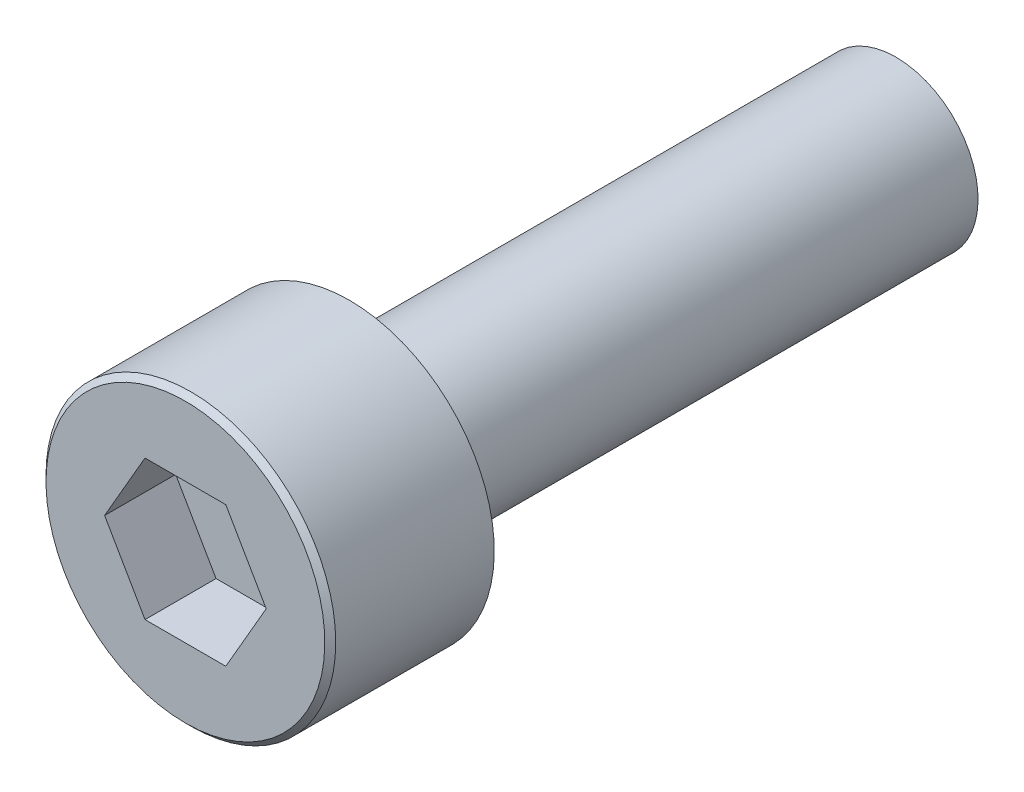
ISO-10303-21;
HEADER;
FILE_DESCRIPTION(('STEP AP214'),'2;1');
FILE_NAME('part.step','',(''),(''),'','','');
FILE_SCHEMA(('AUTOMOTIVE_DESIGN { 1 0 10303 214 1 1 1 1 }'));
ENDSEC;
DATA;
#1=APPLICATION_CONTEXT('core data for automotive mechanical design processes');
#2=APPLICATION_PROTOCOL_DEFINITION('international standard','automotive_design',2000,#1);
#3=PRODUCT_CONTEXT('',#1,'mechanical');
#4=PRODUCT('Part','Part','',(#3));
#5=PRODUCT_RELATED_PRODUCT_CATEGORY('part','',(#4));
#6=PRODUCT_DEFINITION_FORMATION('','',#4);
#7=PRODUCT_DEFINITION_CONTEXT('part definition',#1,'design');
#8=PRODUCT_DEFINITION('design','',#6,#7);
#9=PRODUCT_DEFINITION_SHAPE('','',#8);
#10=(LENGTH_UNIT() NAMED_UNIT(*) SI_UNIT(.MILLI.,.METRE.));
#11=(NAMED_UNIT(*) PLANE_ANGLE_UNIT() SI_UNIT($,.RADIAN.));
#12=(NAMED_UNIT(*) SI_UNIT($,.STERADIAN.) SOLID_ANGLE_UNIT());
#13=UNCERTAINTY_MEASURE_WITH_UNIT(LENGTH_MEASURE(1.E-05),#10,'distance_accuracy_value','');
#14=(GEOMETRIC_REPRESENTATION_CONTEXT(3) GLOBAL_UNCERTAINTY_ASSIGNED_CONTEXT((#13)) GLOBAL_UNIT_ASSIGNED_CONTEXT((#10,
#11,#12)) REPRESENTATION_CONTEXT('',''));
#15=CARTESIAN_POINT('',(0.,0.,0.));
#16=DIRECTION('',(0.,0.,1.));
#17=DIRECTION('',(1.,0.,0.));
#18=AXIS2_PLACEMENT_3D('',#15,#16,#17);
#19=CARTESIAN_POINT('',(0.,0.,0.));
#20=DIRECTION('',(0.,0.,1.));
#21=DIRECTION('',(0.,-1.,0.));
#22=AXIS2_PLACEMENT_3D('',#19,#20,#21);
#23=PLANE('',#22);
#24=CARTESIAN_POINT('',(0.,0.,0.));
#25=DIRECTION('',(0.,0.,1.));
#26=DIRECTION('',(0.,-1.,0.));
#27=AXIS2_PLACEMENT_3D('',#24,#25,#26);
#28=CIRCLE('',#27,2.54999999999998);
#29=CARTESIAN_POINT('',(0.,-2.54999999999998,0.));
#30=VERTEX_POINT('',#29);
#31=EDGE_CURVE('E11',#30,#30,#28,.T.);
#32=ORIENTED_EDGE('',*,*,#31,.T.);
#33=EDGE_LOOP('',(#32));
#34=FACE_BOUND('',#33,.T.);
#35=DIRECTION('',(-0.5,0.866025403784438,0.));
#36=VECTOR('',#35,1.);
#37=CARTESIAN_POINT('',(1.47801668912544,0.,0.));
#38=LINE('',#37,#36);
#39=CARTESIAN_POINT('',(1.47801668912544,0.,0.));
#40=VERTEX_POINT('',#39);
#41=CARTESIAN_POINT('',(0.739008344562721,1.28,0.));
#42=VERTEX_POINT('',#41);
#43=EDGE_CURVE('E57',#40,#42,#38,.T.);
#44=ORIENTED_EDGE('',*,*,#43,.F.);
#45=DIRECTION('',(0.5,0.866025403784439,0.));
#46=VECTOR('',#45,1.);
#47=CARTESIAN_POINT('',(0.739008344562721,-1.28,0.));
#48=LINE('',#47,#46);
#49=CARTESIAN_POINT('',(0.739008344562721,-1.28,0.));
#50=VERTEX_POINT('',#49);
#51=EDGE_CURVE('E140',#50,#40,#48,.T.);
#52=ORIENTED_EDGE('',*,*,#51,.F.);
#53=DIRECTION('',(1.,0.,0.));
#54=VECTOR('',#53,1.);
#55=CARTESIAN_POINT('',(-0.739008344562721,-1.28,0.));
#56=LINE('',#55,#54);
#57=CARTESIAN_POINT('',(-0.739008344562721,-1.28,0.));
#58=VERTEX_POINT('',#57);
#59=EDGE_CURVE('E138',#58,#50,#56,.T.);
#60=ORIENTED_EDGE('',*,*,#59,.F.);
#61=DIRECTION('',(0.5,-0.866025403784439,0.));
#62=VECTOR('',#61,1.);
#63=CARTESIAN_POINT('',(-1.47801668912544,0.,0.));
#64=LINE('',#63,#62);
#65=CARTESIAN_POINT('',(-1.47801668912544,0.,0.));
#66=VERTEX_POINT('',#65);
#67=EDGE_CURVE('E105',#66,#58,#64,.T.);
#68=ORIENTED_EDGE('',*,*,#67,.F.);
#69=DIRECTION('',(-0.5,-0.866025403784439,0.));
#70=VECTOR('',#69,1.);
#71=CARTESIAN_POINT('',(-0.739008344562721,1.28,0.));
#72=LINE('',#71,#70);
#73=CARTESIAN_POINT('',(-0.739008344562721,1.28,0.));
#74=VERTEX_POINT('',#73);
#75=EDGE_CURVE('E134',#74,#66,#72,.T.);
#76=ORIENTED_EDGE('',*,*,#75,.F.);
#77=DIRECTION('',(-1.,0.,0.));
#78=VECTOR('',#77,1.);
#79=CARTESIAN_POINT('',(0.739008344562721,1.28,0.));
#80=LINE('',#79,#78);
#81=EDGE_CURVE('E131',#42,#74,#80,.T.);
#82=ORIENTED_EDGE('',*,*,#81,.F.);
#83=EDGE_LOOP('',(#44,#52,#60,#68,#76,#82));
#84=FACE_BOUND('',#83,.T.);
#85=ADVANCED_FACE('F41',(#34,#84),#23,.T.);
#86=CARTESIAN_POINT('',(0.,0.,-13.));
#87=DIRECTION('',(0.,0.,-1.));
#88=DIRECTION('',(0.,1.,0.));
#89=AXIS2_PLACEMENT_3D('',#86,#87,#88);
#90=CYLINDRICAL_SURFACE('',#89,2.64999999999998);
#91=CARTESIAN_POINT('',(0.,0.,-0.100000000000003));
#92=DIRECTION('',(0.,0.,1.));
#93=DIRECTION('',(0.,-1.,0.));
#94=AXIS2_PLACEMENT_3D('',#91,#92,#93);
#95=CIRCLE('',#94,2.64999999999998);
#96=CARTESIAN_POINT('',(0.,-2.64999999999998,-0.100000000000003));
#97=VERTEX_POINT('',#96);
#98=EDGE_CURVE('E50',#97,#97,#95,.F.);
#99=ORIENTED_EDGE('',*,*,#98,.T.);
#100=EDGE_LOOP('',(#99));
#101=FACE_BOUND('',#100,.T.);
#102=CARTESIAN_POINT('',(0.,0.,-3.));
#103=DIRECTION('',(0.,0.,-1.));
#104=DIRECTION('',(0.,1.,0.));
#105=AXIS2_PLACEMENT_3D('',#102,#103,#104);
#106=CIRCLE('',#105,2.64999999999998);
#107=CARTESIAN_POINT('',(0.,2.64999999999998,-3.));
#108=VERTEX_POINT('',#107);
#109=EDGE_CURVE('E155',#108,#108,#106,.T.);
#110=ORIENTED_EDGE('',*,*,#109,.F.);
#111=EDGE_LOOP('',(#110));
#112=FACE_BOUND('',#111,.T.);
#113=ADVANCED_FACE('F160',(#101,#112),#90,.T.);
#114=CARTESIAN_POINT('',(0.,2.64999999999998,-3.));
#115=DIRECTION('',(0.,0.,-1.));
#116=DIRECTION('',(0.,1.,0.));
#117=AXIS2_PLACEMENT_3D('',#114,#115,#116);
#118=PLANE('',#117);
#119=ORIENTED_EDGE('',*,*,#109,.T.);
#120=EDGE_LOOP('',(#119));
#121=FACE_BOUND('',#120,.T.);
#122=CARTESIAN_POINT('',(0.,0.,-3.));
#123=DIRECTION('',(0.,0.,-1.));
#124=DIRECTION('',(0.,1.,0.));
#125=AXIS2_PLACEMENT_3D('',#122,#123,#124);
#126=CIRCLE('',#125,1.49999999999999);
#127=CARTESIAN_POINT('',(0.,1.49999999999999,-3.));
#128=VERTEX_POINT('',#127);
#129=EDGE_CURVE('E152',#128,#128,#126,.T.);
#130=ORIENTED_EDGE('',*,*,#129,.F.);
#131=EDGE_LOOP('',(#130));
#132=FACE_BOUND('',#131,.T.);
#133=ADVANCED_FACE('F176',(#121,#132),#118,.T.);
#134=CARTESIAN_POINT('',(0.,0.,-13.));
#135=DIRECTION('',(0.,0.,-1.));
#136=DIRECTION('',(0.,1.,0.));
#137=AXIS2_PLACEMENT_3D('',#134,#135,#136);
#138=CYLINDRICAL_SURFACE('',#137,1.49999999999999);
#139=ORIENTED_EDGE('',*,*,#129,.T.);
#140=EDGE_LOOP('',(#139));
#141=FACE_BOUND('',#140,.T.);
#142=CARTESIAN_POINT('',(0.,0.,-13.));
#143=DIRECTION('',(0.,0.,-1.));
#144=DIRECTION('',(0.,1.,0.));
#145=AXIS2_PLACEMENT_3D('',#142,#143,#144);
#146=CIRCLE('',#145,1.5);
#147=CARTESIAN_POINT('',(0.,1.5,-13.));
#148=VERTEX_POINT('',#147);
#149=EDGE_CURVE('E144',#148,#148,#146,.T.);
#150=ORIENTED_EDGE('',*,*,#149,.F.);
#151=EDGE_LOOP('',(#150));
#152=FACE_BOUND('',#151,.T.);
#153=ADVANCED_FACE('F182',(#141,#152),#138,.T.);
#154=CARTESIAN_POINT('',(0.,1.5,-13.));
#155=DIRECTION('',(0.,0.,-1.));
#156=DIRECTION('',(0.,1.,0.));
#157=AXIS2_PLACEMENT_3D('',#154,#155,#156);
#158=PLANE('',#157);
#159=ORIENTED_EDGE('',*,*,#149,.T.);
#160=EDGE_LOOP('',(#159));
#161=FACE_BOUND('',#160,.T.);
#162=ADVANCED_FACE('F186',(#161),#158,.T.);
#163=CARTESIAN_POINT('',(1.47801668912544,0.,-1.3));
#164=DIRECTION('',(0.866025403784438,0.5,0.));
#165=DIRECTION('',(-0.5,0.866025403784439,0.));
#166=AXIS2_PLACEMENT_3D('',#163,#164,#165);
#167=PLANE('',#166);
#168=ORIENTED_EDGE('',*,*,#43,.T.);
#169=DIRECTION('',(0.,0.,1.));
#170=VECTOR('',#169,1.);
#171=CARTESIAN_POINT('',(0.739008344562721,1.28,-1.3));
#172=LINE('',#171,#170);
#173=CARTESIAN_POINT('',(0.739008344562721,1.28,-1.3));
#174=VERTEX_POINT('',#173);
#175=EDGE_CURVE('E87',#174,#42,#172,.T.);
#176=ORIENTED_EDGE('',*,*,#175,.F.);
#177=DIRECTION('',(-0.5,0.866025403784438,0.));
#178=VECTOR('',#177,1.);
#179=CARTESIAN_POINT('',(1.47801668912544,0.,-1.3));
#180=LINE('',#179,#178);
#181=CARTESIAN_POINT('',(1.47801668912544,0.,-1.3));
#182=VERTEX_POINT('',#181);
#183=EDGE_CURVE('E142',#182,#174,#180,.T.);
#184=ORIENTED_EDGE('',*,*,#183,.F.);
#185=DIRECTION('',(0.,0.,1.));
#186=VECTOR('',#185,1.);
#187=CARTESIAN_POINT('',(1.47801668912544,0.,-1.3));
#188=LINE('',#187,#186);
#189=EDGE_CURVE('E65',#182,#40,#188,.T.);
#190=ORIENTED_EDGE('',*,*,#189,.T.);
#191=EDGE_LOOP('',(#168,#176,#184,#190));
#192=FACE_BOUND('',#191,.T.);
#193=ADVANCED_FACE('F190',(#192),#167,.F.);
#194=CARTESIAN_POINT('',(0.739008344562721,-1.28,-1.3));
#195=DIRECTION('',(0.866025403784439,-0.5,0.));
#196=DIRECTION('',(0.5,0.866025403784439,0.));
#197=AXIS2_PLACEMENT_3D('',#194,#195,#196);
#198=PLANE('',#197);
#199=ORIENTED_EDGE('',*,*,#51,.T.);
#200=ORIENTED_EDGE('',*,*,#189,.F.);
#201=DIRECTION('',(0.5,0.866025403784439,0.));
#202=VECTOR('',#201,1.);
#203=CARTESIAN_POINT('',(0.739008344562721,-1.28,-1.3));
#204=LINE('',#203,#202);
#205=CARTESIAN_POINT('',(0.739008344562721,-1.28,-1.3));
#206=VERTEX_POINT('',#205);
#207=EDGE_CURVE('E117',#206,#182,#204,.T.);
#208=ORIENTED_EDGE('',*,*,#207,.F.);
#209=DIRECTION('',(0.,0.,1.));
#210=VECTOR('',#209,1.);
#211=CARTESIAN_POINT('',(0.739008344562721,-1.28,-1.3));
#212=LINE('',#211,#210);
#213=EDGE_CURVE('E109',#206,#50,#212,.T.);
#214=ORIENTED_EDGE('',*,*,#213,.T.);
#215=EDGE_LOOP('',(#199,#200,#208,#214));
#216=FACE_BOUND('',#215,.T.);
#217=ADVANCED_FACE('F194',(#216),#198,.F.);
#218=CARTESIAN_POINT('',(-0.739008344562721,-1.28,-1.3));
#219=DIRECTION('',(0.,-1.,0.));
#220=DIRECTION('',(0.,0.,-1.));
#221=AXIS2_PLACEMENT_3D('',#218,#219,#220);
#222=PLANE('',#221);
#223=ORIENTED_EDGE('',*,*,#59,.T.);
#224=ORIENTED_EDGE('',*,*,#213,.F.);
#225=DIRECTION('',(1.,0.,0.));
#226=VECTOR('',#225,1.);
#227=CARTESIAN_POINT('',(-0.739008344562721,-1.28,-1.3));
#228=LINE('',#227,#226);
#229=CARTESIAN_POINT('',(-0.739008344562721,-1.28,-1.3));
#230=VERTEX_POINT('',#229);
#231=EDGE_CURVE('E113',#230,#206,#228,.T.);
#232=ORIENTED_EDGE('',*,*,#231,.F.);
#233=DIRECTION('',(0.,0.,1.));
#234=VECTOR('',#233,1.);
#235=CARTESIAN_POINT('',(-0.739008344562721,-1.28,-1.3));
#236=LINE('',#235,#234);
#237=EDGE_CURVE('E98',#230,#58,#236,.T.);
#238=ORIENTED_EDGE('',*,*,#237,.T.);
#239=EDGE_LOOP('',(#223,#224,#232,#238));
#240=FACE_BOUND('',#239,.T.);
#241=ADVANCED_FACE('F114',(#240),#222,.F.);
#242=CARTESIAN_POINT('',(-1.47801668912544,0.,-1.3));
#243=DIRECTION('',(-0.866025403784439,-0.5,0.));
#244=DIRECTION('',(0.5,-0.866025403784439,0.));
#245=AXIS2_PLACEMENT_3D('',#242,#243,#244);
#246=PLANE('',#245);
#247=ORIENTED_EDGE('',*,*,#67,.T.);
#248=ORIENTED_EDGE('',*,*,#237,.F.);
#249=DIRECTION('',(0.5,-0.866025403784439,0.));
#250=VECTOR('',#249,1.);
#251=CARTESIAN_POINT('',(-1.47801668912544,0.,-1.3));
#252=LINE('',#251,#250);
#253=CARTESIAN_POINT('',(-1.47801668912544,0.,-1.3));
#254=VERTEX_POINT('',#253);
#255=EDGE_CURVE('E102',#254,#230,#252,.T.);
#256=ORIENTED_EDGE('',*,*,#255,.F.);
#257=DIRECTION('',(0.,0.,1.));
#258=VECTOR('',#257,1.);
#259=CARTESIAN_POINT('',(-1.47801668912544,0.,-1.3));
#260=LINE('',#259,#258);
#261=EDGE_CURVE('E110',#254,#66,#260,.T.);
#262=ORIENTED_EDGE('',*,*,#261,.T.);
#263=EDGE_LOOP('',(#247,#248,#256,#262));
#264=FACE_BOUND('',#263,.T.);
#265=ADVANCED_FACE('F100',(#264),#246,.F.);
#266=CARTESIAN_POINT('',(-0.739008344562721,1.28,-1.3));
#267=DIRECTION('',(-0.866025403784439,0.5,0.));
#268=DIRECTION('',(-0.5,-0.866025403784439,0.));
#269=AXIS2_PLACEMENT_3D('',#266,#267,#268);
#270=PLANE('',#269);
#271=ORIENTED_EDGE('',*,*,#75,.T.);
#272=ORIENTED_EDGE('',*,*,#261,.F.);
#273=DIRECTION('',(-0.5,-0.866025403784439,0.));
#274=VECTOR('',#273,1.);
#275=CARTESIAN_POINT('',(-0.739008344562721,1.28,-1.3));
#276=LINE('',#275,#274);
#277=CARTESIAN_POINT('',(-0.739008344562721,1.28,-1.3));
#278=VERTEX_POINT('',#277);
#279=EDGE_CURVE('E123',#278,#254,#276,.T.);
#280=ORIENTED_EDGE('',*,*,#279,.F.);
#281=DIRECTION('',(0.,0.,1.));
#282=VECTOR('',#281,1.);
#283=CARTESIAN_POINT('',(-0.739008344562721,1.28,-1.3));
#284=LINE('',#283,#282);
#285=EDGE_CURVE('E147',#278,#74,#284,.T.);
#286=ORIENTED_EDGE('',*,*,#285,.T.);
#287=EDGE_LOOP('',(#271,#272,#280,#286));
#288=FACE_BOUND('',#287,.T.);
#289=ADVANCED_FACE('F197',(#288),#270,.F.);
#290=CARTESIAN_POINT('',(0.739008344562721,1.28,-1.3));
#291=DIRECTION('',(0.,1.,0.));
#292=DIRECTION('',(-1.,0.,0.));
#293=AXIS2_PLACEMENT_3D('',#290,#291,#292);
#294=PLANE('',#293);
#295=ORIENTED_EDGE('',*,*,#81,.T.);
#296=ORIENTED_EDGE('',*,*,#285,.F.);
#297=DIRECTION('',(-1.,0.,0.));
#298=VECTOR('',#297,1.);
#299=CARTESIAN_POINT('',(0.739008344562721,1.28,-1.3));
#300=LINE('',#299,#298);
#301=EDGE_CURVE('E125',#174,#278,#300,.T.);
#302=ORIENTED_EDGE('',*,*,#301,.F.);
#303=ORIENTED_EDGE('',*,*,#175,.T.);
#304=EDGE_LOOP('',(#295,#296,#302,#303));
#305=FACE_BOUND('',#304,.T.);
#306=ADVANCED_FACE('F168',(#305),#294,.F.);
#307=CARTESIAN_POINT('',(0.,0.,-1.3));
#308=DIRECTION('',(0.,0.,1.));
#309=DIRECTION('',(1.,0.,0.));
#310=AXIS2_PLACEMENT_3D('',#307,#308,#309);
#311=PLANE('',#310);
#312=ORIENTED_EDGE('',*,*,#183,.T.);
#313=ORIENTED_EDGE('',*,*,#301,.T.);
#314=ORIENTED_EDGE('',*,*,#279,.T.);
#315=ORIENTED_EDGE('',*,*,#255,.T.);
#316=ORIENTED_EDGE('',*,*,#231,.T.);
#317=ORIENTED_EDGE('',*,*,#207,.T.);
#318=EDGE_LOOP('',(#312,#313,#314,#315,#316,#317));
#319=FACE_BOUND('',#318,.T.);
#320=ADVANCED_FACE('F120',(#319),#311,.T.);
#321=CARTESIAN_POINT('',(0.,0.,-0.100000000000003));
#322=DIRECTION('',(0.,0.,-1.));
#323=DIRECTION('',(0.,1.,0.));
#324=AXIS2_PLACEMENT_3D('',#321,#322,#323);
#325=CONICAL_SURFACE('',#324,2.64999999999998,0.785398163397455);
#326=ORIENTED_EDGE('',*,*,#31,.F.);
#327=EDGE_LOOP('',(#326));
#328=FACE_BOUND('',#327,.T.);
#329=ORIENTED_EDGE('',*,*,#98,.F.);
#330=EDGE_LOOP('',(#329));
#331=FACE_BOUND('',#330,.T.);
#332=ADVANCED_FACE('F44',(#328,#331),#325,.T.);
#333=CLOSED_SHELL('',(#85,#113,#133,#153,#162,#193,#217,#241,#265,#289,#306,#320,#332));
#334=MANIFOLD_SOLID_BREP('B2',#333);
#335=ADVANCED_BREP_SHAPE_REPRESENTATION('',(#18,#334),#14);
#336=SHAPE_DEFINITION_REPRESENTATION(#9,#335);
ENDSEC;
END-ISO-10303-21;
